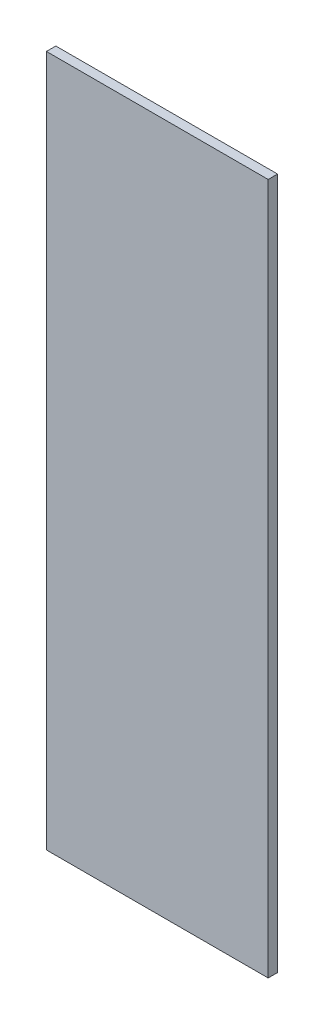
ISO-10303-21;
HEADER;
FILE_DESCRIPTION(('STEP AP214'),'2;1');
FILE_NAME('part.step','',(''),(''),'','','');
FILE_SCHEMA(('AUTOMOTIVE_DESIGN { 1 0 10303 214 1 1 1 1 }'));
ENDSEC;
DATA;
#1=APPLICATION_CONTEXT('core data for automotive mechanical design processes');
#2=APPLICATION_PROTOCOL_DEFINITION('international standard','automotive_design',2000,#1);
#3=PRODUCT_CONTEXT('',#1,'mechanical');
#4=PRODUCT('Part','Part','',(#3));
#5=PRODUCT_RELATED_PRODUCT_CATEGORY('part','',(#4));
#6=PRODUCT_DEFINITION_FORMATION('','',#4);
#7=PRODUCT_DEFINITION_CONTEXT('part definition',#1,'design');
#8=PRODUCT_DEFINITION('design','',#6,#7);
#9=PRODUCT_DEFINITION_SHAPE('','',#8);
#10=(LENGTH_UNIT() NAMED_UNIT(*) SI_UNIT(.MILLI.,.METRE.));
#11=(NAMED_UNIT(*) PLANE_ANGLE_UNIT() SI_UNIT($,.RADIAN.));
#12=(NAMED_UNIT(*) SI_UNIT($,.STERADIAN.) SOLID_ANGLE_UNIT());
#13=UNCERTAINTY_MEASURE_WITH_UNIT(LENGTH_MEASURE(1.E-05),#10,'distance_accuracy_value','');
#14=(GEOMETRIC_REPRESENTATION_CONTEXT(3) GLOBAL_UNCERTAINTY_ASSIGNED_CONTEXT((#13)) GLOBAL_UNIT_ASSIGNED_CONTEXT((#10,
#11,#12)) REPRESENTATION_CONTEXT('',''));
#15=CARTESIAN_POINT('',(0.,0.,0.));
#16=DIRECTION('',(0.,0.,1.));
#17=DIRECTION('',(1.,0.,0.));
#18=AXIS2_PLACEMENT_3D('',#15,#16,#17);
#19=CARTESIAN_POINT('',(59.,-184.,5.));
#20=DIRECTION('',(-1.,0.,0.));
#21=DIRECTION('',(0.,0.,1.));
#22=AXIS2_PLACEMENT_3D('',#19,#20,#21);
#23=PLANE('',#22);
#24=DIRECTION('',(0.,1.,0.));
#25=VECTOR('',#24,1.);
#26=CARTESIAN_POINT('',(59.,-184.,0.));
#27=LINE('',#26,#25);
#28=CARTESIAN_POINT('',(59.,-184.,0.));
#29=VERTEX_POINT('',#28);
#30=CARTESIAN_POINT('',(59.,184.,0.));
#31=VERTEX_POINT('',#30);
#32=EDGE_CURVE('E102',#29,#31,#27,.T.);
#33=ORIENTED_EDGE('',*,*,#32,.T.);
#34=DIRECTION('',(0.,0.,-1.));
#35=VECTOR('',#34,1.);
#36=CARTESIAN_POINT('',(59.,184.,5.));
#37=LINE('',#36,#35);
#38=CARTESIAN_POINT('',(59.,184.,5.));
#39=VERTEX_POINT('',#38);
#40=EDGE_CURVE('E11',#39,#31,#37,.T.);
#41=ORIENTED_EDGE('',*,*,#40,.F.);
#42=DIRECTION('',(0.,1.,0.));
#43=VECTOR('',#42,1.);
#44=CARTESIAN_POINT('',(59.,-184.,5.));
#45=LINE('',#44,#43);
#46=CARTESIAN_POINT('',(59.,-184.,5.));
#47=VERTEX_POINT('',#46);
#48=EDGE_CURVE('E90',#47,#39,#45,.T.);
#49=ORIENTED_EDGE('',*,*,#48,.F.);
#50=DIRECTION('',(0.,0.,-1.));
#51=VECTOR('',#50,1.);
#52=CARTESIAN_POINT('',(59.,-184.,5.));
#53=LINE('',#52,#51);
#54=EDGE_CURVE('E98',#47,#29,#53,.T.);
#55=ORIENTED_EDGE('',*,*,#54,.T.);
#56=EDGE_LOOP('',(#33,#41,#49,#55));
#57=FACE_BOUND('',#56,.T.);
#58=ADVANCED_FACE('F39',(#57),#23,.F.);
#59=CARTESIAN_POINT('',(-59.,184.,5.));
#60=DIRECTION('',(0.,-1.,0.));
#61=DIRECTION('',(0.,0.,-1.));
#62=AXIS2_PLACEMENT_3D('',#59,#60,#61);
#63=PLANE('',#62);
#64=DIRECTION('',(-1.,0.,0.));
#65=VECTOR('',#64,1.);
#66=CARTESIAN_POINT('',(-59.,184.,0.));
#67=LINE('',#66,#65);
#68=CARTESIAN_POINT('',(-59.,184.,0.));
#69=VERTEX_POINT('',#68);
#70=EDGE_CURVE('E94',#31,#69,#67,.T.);
#71=ORIENTED_EDGE('',*,*,#70,.T.);
#72=DIRECTION('',(0.,0.,-1.));
#73=VECTOR('',#72,1.);
#74=CARTESIAN_POINT('',(-59.,184.,5.));
#75=LINE('',#74,#73);
#76=CARTESIAN_POINT('',(-59.,184.,5.));
#77=VERTEX_POINT('',#76);
#78=EDGE_CURVE('E47',#77,#69,#75,.T.);
#79=ORIENTED_EDGE('',*,*,#78,.F.);
#80=DIRECTION('',(-1.,0.,0.));
#81=VECTOR('',#80,1.);
#82=CARTESIAN_POINT('',(-59.,184.,5.));
#83=LINE('',#82,#81);
#84=EDGE_CURVE('E85',#39,#77,#83,.T.);
#85=ORIENTED_EDGE('',*,*,#84,.F.);
#86=ORIENTED_EDGE('',*,*,#40,.T.);
#87=EDGE_LOOP('',(#71,#79,#85,#86));
#88=FACE_BOUND('',#87,.T.);
#89=ADVANCED_FACE('F93',(#88),#63,.F.);
#90=CARTESIAN_POINT('',(-59.,-184.,5.));
#91=DIRECTION('',(1.,0.,0.));
#92=DIRECTION('',(0.,0.,-1.));
#93=AXIS2_PLACEMENT_3D('',#90,#91,#92);
#94=PLANE('',#93);
#95=DIRECTION('',(0.,-1.,0.));
#96=VECTOR('',#95,1.);
#97=CARTESIAN_POINT('',(-59.,-184.,0.));
#98=LINE('',#97,#96);
#99=CARTESIAN_POINT('',(-59.,-184.,0.));
#100=VERTEX_POINT('',#99);
#101=EDGE_CURVE('E72',#69,#100,#98,.T.);
#102=ORIENTED_EDGE('',*,*,#101,.T.);
#103=DIRECTION('',(0.,0.,-1.));
#104=VECTOR('',#103,1.);
#105=CARTESIAN_POINT('',(-59.,-184.,5.));
#106=LINE('',#105,#104);
#107=CARTESIAN_POINT('',(-59.,-184.,5.));
#108=VERTEX_POINT('',#107);
#109=EDGE_CURVE('E95',#108,#100,#106,.T.);
#110=ORIENTED_EDGE('',*,*,#109,.F.);
#111=DIRECTION('',(0.,-1.,0.));
#112=VECTOR('',#111,1.);
#113=CARTESIAN_POINT('',(-59.,-184.,5.));
#114=LINE('',#113,#112);
#115=EDGE_CURVE('E88',#77,#108,#114,.T.);
#116=ORIENTED_EDGE('',*,*,#115,.F.);
#117=ORIENTED_EDGE('',*,*,#78,.T.);
#118=EDGE_LOOP('',(#102,#110,#116,#117));
#119=FACE_BOUND('',#118,.T.);
#120=ADVANCED_FACE('F96',(#119),#94,.F.);
#121=CARTESIAN_POINT('',(-59.,-184.,5.));
#122=DIRECTION('',(0.,1.,0.));
#123=DIRECTION('',(0.,0.,1.));
#124=AXIS2_PLACEMENT_3D('',#121,#122,#123);
#125=PLANE('',#124);
#126=DIRECTION('',(1.,0.,0.));
#127=VECTOR('',#126,1.);
#128=CARTESIAN_POINT('',(-59.,-184.,0.));
#129=LINE('',#128,#127);
#130=EDGE_CURVE('E78',#100,#29,#129,.T.);
#131=ORIENTED_EDGE('',*,*,#130,.T.);
#132=ORIENTED_EDGE('',*,*,#54,.F.);
#133=DIRECTION('',(1.,0.,0.));
#134=VECTOR('',#133,1.);
#135=CARTESIAN_POINT('',(-59.,-184.,5.));
#136=LINE('',#135,#134);
#137=EDGE_CURVE('E55',#108,#47,#136,.T.);
#138=ORIENTED_EDGE('',*,*,#137,.F.);
#139=ORIENTED_EDGE('',*,*,#109,.T.);
#140=EDGE_LOOP('',(#131,#132,#138,#139));
#141=FACE_BOUND('',#140,.T.);
#142=ADVANCED_FACE('F109',(#141),#125,.F.);
#143=CARTESIAN_POINT('',(0.,0.,5.));
#144=DIRECTION('',(0.,0.,-1.));
#145=DIRECTION('',(-1.,0.,0.));
#146=AXIS2_PLACEMENT_3D('',#143,#144,#145);
#147=PLANE('',#146);
#148=ORIENTED_EDGE('',*,*,#48,.T.);
#149=ORIENTED_EDGE('',*,*,#84,.T.);
#150=ORIENTED_EDGE('',*,*,#115,.T.);
#151=ORIENTED_EDGE('',*,*,#137,.T.);
#152=EDGE_LOOP('',(#148,#149,#150,#151));
#153=FACE_BOUND('',#152,.T.);
#154=ADVANCED_FACE('F86',(#153),#147,.F.);
#155=CARTESIAN_POINT('',(0.,0.,0.));
#156=DIRECTION('',(0.,0.,-1.));
#157=DIRECTION('',(-1.,0.,0.));
#158=AXIS2_PLACEMENT_3D('',#155,#156,#157);
#159=PLANE('',#158);
#160=ORIENTED_EDGE('',*,*,#32,.F.);
#161=ORIENTED_EDGE('',*,*,#130,.F.);
#162=ORIENTED_EDGE('',*,*,#101,.F.);
#163=ORIENTED_EDGE('',*,*,#70,.F.);
#164=EDGE_LOOP('',(#160,#161,#162,#163));
#165=FACE_BOUND('',#164,.T.);
#166=ADVANCED_FACE('F112',(#165),#159,.T.);
#167=CLOSED_SHELL('',(#58,#89,#120,#142,#154,#166));
#168=MANIFOLD_SOLID_BREP('B2',#167);
#169=ADVANCED_BREP_SHAPE_REPRESENTATION('',(#18,#168),#14);
#170=SHAPE_DEFINITION_REPRESENTATION(#9,#169);
ENDSEC;
END-ISO-10303-21;
